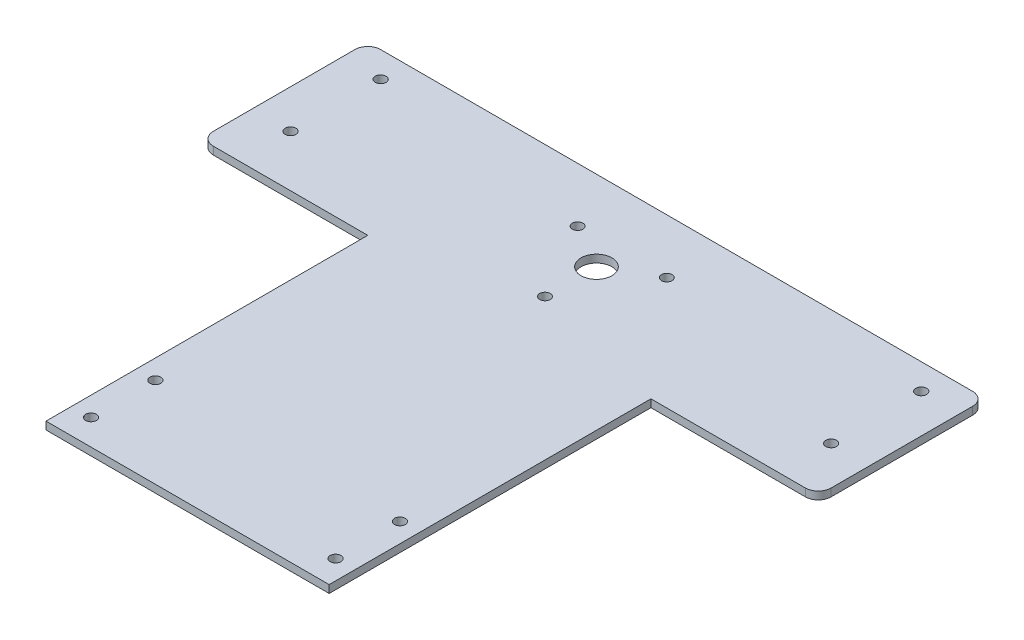
ISO-10303-21;
HEADER;
FILE_DESCRIPTION(('STEP AP214'),'2;1');
FILE_NAME('part.step','',(''),(''),'','','');
FILE_SCHEMA(('AUTOMOTIVE_DESIGN { 1 0 10303 214 1 1 1 1 }'));
ENDSEC;
DATA;
#1=APPLICATION_CONTEXT('core data for automotive mechanical design processes');
#2=APPLICATION_PROTOCOL_DEFINITION('international standard','automotive_design',2000,#1);
#3=PRODUCT_CONTEXT('',#1,'mechanical');
#4=PRODUCT('Part','Part','',(#3));
#5=PRODUCT_RELATED_PRODUCT_CATEGORY('part','',(#4));
#6=PRODUCT_DEFINITION_FORMATION('','',#4);
#7=PRODUCT_DEFINITION_CONTEXT('part definition',#1,'design');
#8=PRODUCT_DEFINITION('design','',#6,#7);
#9=PRODUCT_DEFINITION_SHAPE('','',#8);
#10=(LENGTH_UNIT() NAMED_UNIT(*) SI_UNIT(.MILLI.,.METRE.));
#11=(NAMED_UNIT(*) PLANE_ANGLE_UNIT() SI_UNIT($,.RADIAN.));
#12=(NAMED_UNIT(*) SI_UNIT($,.STERADIAN.) SOLID_ANGLE_UNIT());
#13=UNCERTAINTY_MEASURE_WITH_UNIT(LENGTH_MEASURE(1.E-05),#10,'distance_accuracy_value','');
#14=(GEOMETRIC_REPRESENTATION_CONTEXT(3) GLOBAL_UNCERTAINTY_ASSIGNED_CONTEXT((#13)) GLOBAL_UNIT_ASSIGNED_CONTEXT((#10,
#11,#12)) REPRESENTATION_CONTEXT('',''));
#15=CARTESIAN_POINT('',(0.,0.,0.));
#16=DIRECTION('',(0.,0.,1.));
#17=DIRECTION('',(1.,0.,0.));
#18=AXIS2_PLACEMENT_3D('',#15,#16,#17);
#19=CARTESIAN_POINT('',(0.,3.,0.));
#20=DIRECTION('',(0.,1.,0.));
#21=DIRECTION('',(0.,0.,1.));
#22=AXIS2_PLACEMENT_3D('',#19,#20,#21);
#23=PLANE('',#22);
#24=CARTESIAN_POINT('',(17.3205080756888,3.,-34.4697255648883));
#25=DIRECTION('',(0.,1.,0.));
#26=DIRECTION('',(0.,0.,1.));
#27=AXIS2_PLACEMENT_3D('',#24,#25,#26);
#28=CIRCLE('',#27,2.05);
#29=CARTESIAN_POINT('',(17.3205080756888,3.,-32.4197255648883));
#30=VERTEX_POINT('',#29);
#31=EDGE_CURVE('E616',#30,#30,#28,.T.);
#32=ORIENTED_EDGE('',*,*,#31,.F.);
#33=EDGE_LOOP('',(#32));
#34=FACE_BOUND('',#33,.T.);
#35=CARTESIAN_POINT('',(-17.3205080756887,3.,-34.4697255648885));
#36=DIRECTION('',(0.,1.,0.));
#37=DIRECTION('',(0.,0.,1.));
#38=AXIS2_PLACEMENT_3D('',#35,#36,#37);
#39=CIRCLE('',#38,2.05);
#40=CARTESIAN_POINT('',(-17.3205080756887,3.,-32.4197255648885));
#41=VERTEX_POINT('',#40);
#42=EDGE_CURVE('E612',#41,#41,#39,.T.);
#43=ORIENTED_EDGE('',*,*,#42,.F.);
#44=EDGE_LOOP('',(#43));
#45=FACE_BOUND('',#44,.T.);
#46=CARTESIAN_POINT('',(0.,3.,-4.46972556488845));
#47=DIRECTION('',(0.,1.,0.));
#48=DIRECTION('',(0.,0.,1.));
#49=AXIS2_PLACEMENT_3D('',#46,#47,#48);
#50=CIRCLE('',#49,2.05);
#51=CARTESIAN_POINT('',(0.,3.,-2.41972556488845));
#52=VERTEX_POINT('',#51);
#53=EDGE_CURVE('E416',#52,#52,#50,.T.);
#54=ORIENTED_EDGE('',*,*,#53,.F.);
#55=EDGE_LOOP('',(#54));
#56=FACE_BOUND('',#55,.T.);
#57=CARTESIAN_POINT('',(0.,3.,-24.4697255648884));
#58=DIRECTION('',(0.,1.,0.));
#59=DIRECTION('',(0.,0.,1.));
#60=AXIS2_PLACEMENT_3D('',#57,#58,#59);
#61=CIRCLE('',#60,6.);
#62=CARTESIAN_POINT('',(0.,3.,-18.4697255648884));
#63=VERTEX_POINT('',#62);
#64=EDGE_CURVE('E253',#63,#63,#61,.T.);
#65=ORIENTED_EDGE('',*,*,#64,.F.);
#66=EDGE_LOOP('',(#65));
#67=FACE_BOUND('',#66,.T.);
#68=CARTESIAN_POINT('',(-47.5,3.,99.3749999999999));
#69=DIRECTION('',(0.,-1.,0.));
#70=DIRECTION('',(0.,0.,-1.));
#71=AXIS2_PLACEMENT_3D('',#68,#69,#70);
#72=CIRCLE('',#71,2.1);
#73=CARTESIAN_POINT('',(-47.5,3.,97.2749999999999));
#74=VERTEX_POINT('',#73);
#75=EDGE_CURVE('E264',#74,#74,#72,.T.);
#76=ORIENTED_EDGE('',*,*,#75,.T.);
#77=EDGE_LOOP('',(#76));
#78=FACE_BOUND('',#77,.T.);
#79=CARTESIAN_POINT('',(-47.5,3.,124.375));
#80=DIRECTION('',(0.,1.,0.));
#81=DIRECTION('',(0.,0.,1.));
#82=AXIS2_PLACEMENT_3D('',#79,#80,#81);
#83=CIRCLE('',#82,2.1);
#84=CARTESIAN_POINT('',(-47.5,3.,126.475));
#85=VERTEX_POINT('',#84);
#86=EDGE_CURVE('E260',#85,#85,#83,.T.);
#87=ORIENTED_EDGE('',*,*,#86,.F.);
#88=EDGE_LOOP('',(#87));
#89=FACE_BOUND('',#88,.T.);
#90=CARTESIAN_POINT('',(47.5,3.,99.3749999999999));
#91=DIRECTION('',(0.,1.,0.));
#92=DIRECTION('',(0.,0.,1.));
#93=AXIS2_PLACEMENT_3D('',#90,#91,#92);
#94=CIRCLE('',#93,2.1);
#95=CARTESIAN_POINT('',(47.5,3.,101.475));
#96=VERTEX_POINT('',#95);
#97=EDGE_CURVE('E241',#96,#96,#94,.T.);
#98=ORIENTED_EDGE('',*,*,#97,.F.);
#99=EDGE_LOOP('',(#98));
#100=FACE_BOUND('',#99,.T.);
#101=CARTESIAN_POINT('',(105.,3.,-10.6250000000001));
#102=DIRECTION('',(0.,1.,0.));
#103=DIRECTION('',(0.,0.,1.));
#104=AXIS2_PLACEMENT_3D('',#101,#102,#103);
#105=CIRCLE('',#104,2.1);
#106=CARTESIAN_POINT('',(105.,3.,-8.52500000000007));
#107=VERTEX_POINT('',#106);
#108=EDGE_CURVE('E202',#107,#107,#105,.F.);
#109=ORIENTED_EDGE('',*,*,#108,.T.);
#110=EDGE_LOOP('',(#109));
#111=FACE_BOUND('',#110,.T.);
#112=CARTESIAN_POINT('',(-105.,3.,-10.6250000000001));
#113=DIRECTION('',(0.,1.,0.));
#114=DIRECTION('',(0.,0.,1.));
#115=AXIS2_PLACEMENT_3D('',#112,#113,#114);
#116=CIRCLE('',#115,2.1);
#117=CARTESIAN_POINT('',(-105.,3.,-8.52500000000006));
#118=VERTEX_POINT('',#117);
#119=EDGE_CURVE('E280',#118,#118,#116,.T.);
#120=ORIENTED_EDGE('',*,*,#119,.F.);
#121=EDGE_LOOP('',(#120));
#122=FACE_BOUND('',#121,.T.);
#123=CARTESIAN_POINT('',(-105.,3.,-45.6250000000001));
#124=DIRECTION('',(0.,1.,0.));
#125=DIRECTION('',(0.,0.,1.));
#126=AXIS2_PLACEMENT_3D('',#123,#124,#125);
#127=CIRCLE('',#126,2.1);
#128=CARTESIAN_POINT('',(-105.,3.,-43.5250000000001));
#129=VERTEX_POINT('',#128);
#130=EDGE_CURVE('E137',#129,#129,#127,.T.);
#131=ORIENTED_EDGE('',*,*,#130,.F.);
#132=EDGE_LOOP('',(#131));
#133=FACE_BOUND('',#132,.T.);
#134=DIRECTION('',(1.,0.,0.));
#135=VECTOR('',#134,1.);
#136=CARTESIAN_POINT('',(0.,3.,9.37499999999993));
#137=LINE('',#136,#135);
#138=CARTESIAN_POINT('',(55.,3.,9.37499999999993));
#139=VERTEX_POINT('',#138);
#140=CARTESIAN_POINT('',(115.,3.,9.37499999999993));
#141=VERTEX_POINT('',#140);
#142=EDGE_CURVE('E139',#139,#141,#137,.T.);
#143=ORIENTED_EDGE('',*,*,#142,.T.);
#144=CARTESIAN_POINT('',(115.,3.,4.37499999999993));
#145=DIRECTION('',(0.,1.,0.));
#146=DIRECTION('',(0.,0.,1.));
#147=AXIS2_PLACEMENT_3D('',#144,#145,#146);
#148=CIRCLE('',#147,5.);
#149=CARTESIAN_POINT('',(120.,3.,4.37499999999993));
#150=VERTEX_POINT('',#149);
#151=EDGE_CURVE('E227',#141,#150,#148,.T.);
#152=ORIENTED_EDGE('',*,*,#151,.T.);
#153=DIRECTION('',(0.,0.,-1.));
#154=VECTOR('',#153,1.);
#155=CARTESIAN_POINT('',(120.,3.,0.));
#156=LINE('',#155,#154);
#157=CARTESIAN_POINT('',(120.,3.,-50.6250000000001));
#158=VERTEX_POINT('',#157);
#159=EDGE_CURVE('E160',#150,#158,#156,.T.);
#160=ORIENTED_EDGE('',*,*,#159,.T.);
#161=CARTESIAN_POINT('',(115.,3.,-50.6250000000001));
#162=DIRECTION('',(0.,1.,0.));
#163=DIRECTION('',(0.,0.,1.));
#164=AXIS2_PLACEMENT_3D('',#161,#162,#163);
#165=CIRCLE('',#164,5.);
#166=CARTESIAN_POINT('',(115.,3.,-55.6250000000001));
#167=VERTEX_POINT('',#166);
#168=EDGE_CURVE('E223',#158,#167,#165,.T.);
#169=ORIENTED_EDGE('',*,*,#168,.T.);
#170=DIRECTION('',(1.,0.,0.));
#171=VECTOR('',#170,1.);
#172=CARTESIAN_POINT('',(0.,3.,-55.6250000000001));
#173=LINE('',#172,#171);
#174=CARTESIAN_POINT('',(-115.,3.,-55.6250000000001));
#175=VERTEX_POINT('',#174);
#176=EDGE_CURVE('E163',#175,#167,#173,.T.);
#177=ORIENTED_EDGE('',*,*,#176,.F.);
#178=CARTESIAN_POINT('',(-115.,3.,-50.6250000000001));
#179=DIRECTION('',(0.,1.,0.));
#180=DIRECTION('',(0.,0.,1.));
#181=AXIS2_PLACEMENT_3D('',#178,#179,#180);
#182=CIRCLE('',#181,5.);
#183=CARTESIAN_POINT('',(-120.,3.,-50.6250000000001));
#184=VERTEX_POINT('',#183);
#185=EDGE_CURVE('E52',#175,#184,#182,.T.);
#186=ORIENTED_EDGE('',*,*,#185,.T.);
#187=DIRECTION('',(0.,0.,-1.));
#188=VECTOR('',#187,1.);
#189=CARTESIAN_POINT('',(-120.,3.,0.));
#190=LINE('',#189,#188);
#191=CARTESIAN_POINT('',(-120.,3.,4.37499999999994));
#192=VERTEX_POINT('',#191);
#193=EDGE_CURVE('E166',#192,#184,#190,.T.);
#194=ORIENTED_EDGE('',*,*,#193,.F.);
#195=CARTESIAN_POINT('',(-115.,3.,4.37499999999994));
#196=DIRECTION('',(0.,1.,0.));
#197=DIRECTION('',(0.,0.,1.));
#198=AXIS2_PLACEMENT_3D('',#195,#196,#197);
#199=CIRCLE('',#198,5.);
#200=CARTESIAN_POINT('',(-115.,3.,9.37499999999994));
#201=VERTEX_POINT('',#200);
#202=EDGE_CURVE('E133',#192,#201,#199,.T.);
#203=ORIENTED_EDGE('',*,*,#202,.T.);
#204=CARTESIAN_POINT('',(-55.,3.,9.37499999999994));
#205=VERTEX_POINT('',#204);
#206=EDGE_CURVE('E126',#201,#205,#137,.T.);
#207=ORIENTED_EDGE('',*,*,#206,.T.);
#208=DIRECTION('',(0.,0.,-1.));
#209=VECTOR('',#208,1.);
#210=CARTESIAN_POINT('',(-55.,3.,0.));
#211=LINE('',#210,#209);
#212=CARTESIAN_POINT('',(-55.,3.,134.375));
#213=VERTEX_POINT('',#212);
#214=EDGE_CURVE('E131',#213,#205,#211,.T.);
#215=ORIENTED_EDGE('',*,*,#214,.F.);
#216=DIRECTION('',(1.,0.,0.));
#217=VECTOR('',#216,1.);
#218=CARTESIAN_POINT('',(0.,3.,134.375));
#219=LINE('',#218,#217);
#220=CARTESIAN_POINT('',(55.,3.,134.375));
#221=VERTEX_POINT('',#220);
#222=EDGE_CURVE('E153',#213,#221,#219,.T.);
#223=ORIENTED_EDGE('',*,*,#222,.T.);
#224=DIRECTION('',(0.,0.,-1.));
#225=VECTOR('',#224,1.);
#226=CARTESIAN_POINT('',(55.,3.,0.));
#227=LINE('',#226,#225);
#228=EDGE_CURVE('E155',#221,#139,#227,.T.);
#229=ORIENTED_EDGE('',*,*,#228,.T.);
#230=EDGE_LOOP('',(#143,#152,#160,#169,#177,#186,#194,#203,#207,#215,#223,#229));
#231=FACE_BOUND('',#230,.T.);
#232=CARTESIAN_POINT('',(105.,3.,-45.6250000000001));
#233=DIRECTION('',(0.,1.,0.));
#234=DIRECTION('',(0.,0.,1.));
#235=AXIS2_PLACEMENT_3D('',#232,#233,#234);
#236=CIRCLE('',#235,2.1);
#237=CARTESIAN_POINT('',(105.,3.,-43.5250000000001));
#238=VERTEX_POINT('',#237);
#239=EDGE_CURVE('E168',#238,#238,#236,.F.);
#240=ORIENTED_EDGE('',*,*,#239,.T.);
#241=EDGE_LOOP('',(#240));
#242=FACE_BOUND('',#241,.T.);
#243=CARTESIAN_POINT('',(47.5,3.,124.375));
#244=DIRECTION('',(0.,-1.,0.));
#245=DIRECTION('',(0.,0.,-1.));
#246=AXIS2_PLACEMENT_3D('',#243,#244,#245);
#247=CIRCLE('',#246,2.1);
#248=CARTESIAN_POINT('',(47.5,3.,122.275));
#249=VERTEX_POINT('',#248);
#250=EDGE_CURVE('E269',#249,#249,#247,.T.);
#251=ORIENTED_EDGE('',*,*,#250,.T.);
#252=EDGE_LOOP('',(#251));
#253=FACE_BOUND('',#252,.T.);
#254=ADVANCED_FACE('F35',(#34,#45,#56,#67,#78,#89,#100,#111,#122,#133,#231,#242,#253),#23,.T.);
#255=CARTESIAN_POINT('',(0.,0.,0.));
#256=DIRECTION('',(0.,1.,0.));
#257=DIRECTION('',(0.,0.,1.));
#258=AXIS2_PLACEMENT_3D('',#255,#256,#257);
#259=PLANE('',#258);
#260=CARTESIAN_POINT('',(17.3205080756888,0.,-34.4697255648883));
#261=DIRECTION('',(0.,1.,0.));
#262=DIRECTION('',(0.,0.,1.));
#263=AXIS2_PLACEMENT_3D('',#260,#261,#262);
#264=CIRCLE('',#263,2.05);
#265=CARTESIAN_POINT('',(17.3205080756888,0.,-32.4197255648883));
#266=VERTEX_POINT('',#265);
#267=EDGE_CURVE('E39',#266,#266,#264,.T.);
#268=ORIENTED_EDGE('',*,*,#267,.T.);
#269=EDGE_LOOP('',(#268));
#270=FACE_BOUND('',#269,.T.);
#271=CARTESIAN_POINT('',(-17.3205080756887,0.,-34.4697255648885));
#272=DIRECTION('',(0.,1.,0.));
#273=DIRECTION('',(0.,0.,1.));
#274=AXIS2_PLACEMENT_3D('',#271,#272,#273);
#275=CIRCLE('',#274,2.05);
#276=CARTESIAN_POINT('',(-17.3205080756887,0.,-32.4197255648885));
#277=VERTEX_POINT('',#276);
#278=EDGE_CURVE('E255',#277,#277,#275,.T.);
#279=ORIENTED_EDGE('',*,*,#278,.T.);
#280=EDGE_LOOP('',(#279));
#281=FACE_BOUND('',#280,.T.);
#282=CARTESIAN_POINT('',(0.,0.,-4.46972556488845));
#283=DIRECTION('',(0.,1.,0.));
#284=DIRECTION('',(0.,0.,1.));
#285=AXIS2_PLACEMENT_3D('',#282,#283,#284);
#286=CIRCLE('',#285,2.05);
#287=CARTESIAN_POINT('',(0.,0.,-2.41972556488845));
#288=VERTEX_POINT('',#287);
#289=EDGE_CURVE('E252',#288,#288,#286,.T.);
#290=ORIENTED_EDGE('',*,*,#289,.T.);
#291=EDGE_LOOP('',(#290));
#292=FACE_BOUND('',#291,.T.);
#293=CARTESIAN_POINT('',(0.,0.,-24.4697255648884));
#294=DIRECTION('',(0.,1.,0.));
#295=DIRECTION('',(0.,0.,1.));
#296=AXIS2_PLACEMENT_3D('',#293,#294,#295);
#297=CIRCLE('',#296,6.);
#298=CARTESIAN_POINT('',(0.,0.,-18.4697255648884));
#299=VERTEX_POINT('',#298);
#300=EDGE_CURVE('E249',#299,#299,#297,.T.);
#301=ORIENTED_EDGE('',*,*,#300,.T.);
#302=EDGE_LOOP('',(#301));
#303=FACE_BOUND('',#302,.T.);
#304=CARTESIAN_POINT('',(-47.5,0.,124.375));
#305=DIRECTION('',(0.,1.,0.));
#306=DIRECTION('',(0.,0.,1.));
#307=AXIS2_PLACEMENT_3D('',#304,#305,#306);
#308=CIRCLE('',#307,2.1);
#309=CARTESIAN_POINT('',(-47.5,0.,126.475));
#310=VERTEX_POINT('',#309);
#311=EDGE_CURVE('E240',#310,#310,#308,.T.);
#312=ORIENTED_EDGE('',*,*,#311,.T.);
#313=EDGE_LOOP('',(#312));
#314=FACE_BOUND('',#313,.T.);
#315=CARTESIAN_POINT('',(47.5,0.,99.3749999999999));
#316=DIRECTION('',(0.,1.,0.));
#317=DIRECTION('',(0.,0.,1.));
#318=AXIS2_PLACEMENT_3D('',#315,#316,#317);
#319=CIRCLE('',#318,2.1);
#320=CARTESIAN_POINT('',(47.5,0.,101.475));
#321=VERTEX_POINT('',#320);
#322=EDGE_CURVE('E237',#321,#321,#319,.T.);
#323=ORIENTED_EDGE('',*,*,#322,.T.);
#324=EDGE_LOOP('',(#323));
#325=FACE_BOUND('',#324,.T.);
#326=CARTESIAN_POINT('',(105.,0.,-10.6250000000001));
#327=DIRECTION('',(0.,1.,0.));
#328=DIRECTION('',(0.,0.,1.));
#329=AXIS2_PLACEMENT_3D('',#326,#327,#328);
#330=CIRCLE('',#329,2.1);
#331=CARTESIAN_POINT('',(105.,0.,-8.52500000000007));
#332=VERTEX_POINT('',#331);
#333=EDGE_CURVE('E172',#332,#332,#330,.F.);
#334=ORIENTED_EDGE('',*,*,#333,.F.);
#335=EDGE_LOOP('',(#334));
#336=FACE_BOUND('',#335,.T.);
#337=CARTESIAN_POINT('',(-105.,0.,-10.6250000000001));
#338=DIRECTION('',(0.,1.,0.));
#339=DIRECTION('',(0.,0.,1.));
#340=AXIS2_PLACEMENT_3D('',#337,#338,#339);
#341=CIRCLE('',#340,2.1);
#342=CARTESIAN_POINT('',(-105.,0.,-8.52500000000006));
#343=VERTEX_POINT('',#342);
#344=EDGE_CURVE('E175',#343,#343,#341,.T.);
#345=ORIENTED_EDGE('',*,*,#344,.T.);
#346=EDGE_LOOP('',(#345));
#347=FACE_BOUND('',#346,.T.);
#348=CARTESIAN_POINT('',(-105.,0.,-45.6250000000001));
#349=DIRECTION('',(0.,1.,0.));
#350=DIRECTION('',(0.,0.,1.));
#351=AXIS2_PLACEMENT_3D('',#348,#349,#350);
#352=CIRCLE('',#351,2.1);
#353=CARTESIAN_POINT('',(-105.,0.,-43.5250000000001));
#354=VERTEX_POINT('',#353);
#355=EDGE_CURVE('E179',#354,#354,#352,.T.);
#356=ORIENTED_EDGE('',*,*,#355,.T.);
#357=EDGE_LOOP('',(#356));
#358=FACE_BOUND('',#357,.T.);
#359=DIRECTION('',(0.,0.,-1.));
#360=VECTOR('',#359,1.);
#361=CARTESIAN_POINT('',(120.,0.,0.));
#362=LINE('',#361,#360);
#363=CARTESIAN_POINT('',(120.,0.,4.37499999999993));
#364=VERTEX_POINT('',#363);
#365=CARTESIAN_POINT('',(120.,0.,-50.6250000000001));
#366=VERTEX_POINT('',#365);
#367=EDGE_CURVE('E190',#364,#366,#362,.T.);
#368=ORIENTED_EDGE('',*,*,#367,.F.);
#369=CARTESIAN_POINT('',(115.,0.,4.37499999999993));
#370=DIRECTION('',(0.,1.,0.));
#371=DIRECTION('',(0.,0.,1.));
#372=AXIS2_PLACEMENT_3D('',#369,#370,#371);
#373=CIRCLE('',#372,5.);
#374=CARTESIAN_POINT('',(115.,0.,9.37499999999993));
#375=VERTEX_POINT('',#374);
#376=EDGE_CURVE('E219',#364,#375,#373,.F.);
#377=ORIENTED_EDGE('',*,*,#376,.T.);
#378=DIRECTION('',(1.,0.,0.));
#379=VECTOR('',#378,1.);
#380=CARTESIAN_POINT('',(0.,0.,9.37499999999993));
#381=LINE('',#380,#379);
#382=CARTESIAN_POINT('',(55.,0.,9.37499999999993));
#383=VERTEX_POINT('',#382);
#384=EDGE_CURVE('E184',#383,#375,#381,.T.);
#385=ORIENTED_EDGE('',*,*,#384,.F.);
#386=DIRECTION('',(0.,0.,-1.));
#387=VECTOR('',#386,1.);
#388=CARTESIAN_POINT('',(55.,0.,0.));
#389=LINE('',#388,#387);
#390=CARTESIAN_POINT('',(55.,0.,134.375));
#391=VERTEX_POINT('',#390);
#392=EDGE_CURVE('E188',#391,#383,#389,.T.);
#393=ORIENTED_EDGE('',*,*,#392,.F.);
#394=DIRECTION('',(1.,0.,0.));
#395=VECTOR('',#394,1.);
#396=CARTESIAN_POINT('',(0.,0.,134.375));
#397=LINE('',#396,#395);
#398=CARTESIAN_POINT('',(-55.,0.,134.375));
#399=VERTEX_POINT('',#398);
#400=EDGE_CURVE('E186',#399,#391,#397,.T.);
#401=ORIENTED_EDGE('',*,*,#400,.F.);
#402=DIRECTION('',(0.,0.,-1.));
#403=VECTOR('',#402,1.);
#404=CARTESIAN_POINT('',(-55.,0.,0.));
#405=LINE('',#404,#403);
#406=CARTESIAN_POINT('',(-55.,0.,9.37499999999994));
#407=VERTEX_POINT('',#406);
#408=EDGE_CURVE('E183',#399,#407,#405,.T.);
#409=ORIENTED_EDGE('',*,*,#408,.T.);
#410=CARTESIAN_POINT('',(-115.,0.,9.37499999999994));
#411=VERTEX_POINT('',#410);
#412=EDGE_CURVE('E144',#411,#407,#381,.T.);
#413=ORIENTED_EDGE('',*,*,#412,.F.);
#414=CARTESIAN_POINT('',(-115.,0.,4.37499999999994));
#415=DIRECTION('',(0.,1.,0.));
#416=DIRECTION('',(0.,0.,1.));
#417=AXIS2_PLACEMENT_3D('',#414,#415,#416);
#418=CIRCLE('',#417,5.);
#419=CARTESIAN_POINT('',(-120.,0.,4.37499999999994));
#420=VERTEX_POINT('',#419);
#421=EDGE_CURVE('E217',#411,#420,#418,.F.);
#422=ORIENTED_EDGE('',*,*,#421,.T.);
#423=DIRECTION('',(0.,0.,-1.));
#424=VECTOR('',#423,1.);
#425=CARTESIAN_POINT('',(-120.,0.,0.));
#426=LINE('',#425,#424);
#427=CARTESIAN_POINT('',(-120.,0.,-50.6250000000001));
#428=VERTEX_POINT('',#427);
#429=EDGE_CURVE('E196',#420,#428,#426,.T.);
#430=ORIENTED_EDGE('',*,*,#429,.T.);
#431=CARTESIAN_POINT('',(-115.,0.,-50.6250000000001));
#432=DIRECTION('',(0.,1.,0.));
#433=DIRECTION('',(0.,0.,1.));
#434=AXIS2_PLACEMENT_3D('',#431,#432,#433);
#435=CIRCLE('',#434,5.);
#436=CARTESIAN_POINT('',(-115.,0.,-55.6250000000001));
#437=VERTEX_POINT('',#436);
#438=EDGE_CURVE('E215',#428,#437,#435,.F.);
#439=ORIENTED_EDGE('',*,*,#438,.T.);
#440=DIRECTION('',(1.,0.,0.));
#441=VECTOR('',#440,1.);
#442=CARTESIAN_POINT('',(0.,0.,-55.6250000000001));
#443=LINE('',#442,#441);
#444=CARTESIAN_POINT('',(115.,0.,-55.6250000000001));
#445=VERTEX_POINT('',#444);
#446=EDGE_CURVE('E193',#437,#445,#443,.T.);
#447=ORIENTED_EDGE('',*,*,#446,.T.);
#448=CARTESIAN_POINT('',(115.,0.,-50.6250000000001));
#449=DIRECTION('',(0.,1.,0.));
#450=DIRECTION('',(0.,0.,1.));
#451=AXIS2_PLACEMENT_3D('',#448,#449,#450);
#452=CIRCLE('',#451,5.);
#453=EDGE_CURVE('E213',#445,#366,#452,.F.);
#454=ORIENTED_EDGE('',*,*,#453,.T.);
#455=EDGE_LOOP('',(#368,#377,#385,#393,#401,#409,#413,#422,#430,#439,#447,#454));
#456=FACE_BOUND('',#455,.T.);
#457=CARTESIAN_POINT('',(105.,0.,-45.6250000000001));
#458=DIRECTION('',(0.,1.,0.));
#459=DIRECTION('',(0.,0.,1.));
#460=AXIS2_PLACEMENT_3D('',#457,#458,#459);
#461=CIRCLE('',#460,2.1);
#462=CARTESIAN_POINT('',(105.,0.,-43.5250000000001));
#463=VERTEX_POINT('',#462);
#464=EDGE_CURVE('E199',#463,#463,#461,.F.);
#465=ORIENTED_EDGE('',*,*,#464,.F.);
#466=EDGE_LOOP('',(#465));
#467=FACE_BOUND('',#466,.T.);
#468=CARTESIAN_POINT('',(-47.5,0.,99.3749999999999));
#469=DIRECTION('',(0.,1.,0.));
#470=DIRECTION('',(0.,0.,1.));
#471=AXIS2_PLACEMENT_3D('',#468,#469,#470);
#472=CIRCLE('',#471,2.1);
#473=CARTESIAN_POINT('',(-47.5,0.,101.475));
#474=VERTEX_POINT('',#473);
#475=EDGE_CURVE('E244',#474,#474,#472,.F.);
#476=ORIENTED_EDGE('',*,*,#475,.F.);
#477=EDGE_LOOP('',(#476));
#478=FACE_BOUND('',#477,.T.);
#479=CARTESIAN_POINT('',(47.5,0.,124.375));
#480=DIRECTION('',(0.,1.,0.));
#481=DIRECTION('',(0.,0.,1.));
#482=AXIS2_PLACEMENT_3D('',#479,#480,#481);
#483=CIRCLE('',#482,2.1);
#484=CARTESIAN_POINT('',(47.5,0.,126.475));
#485=VERTEX_POINT('',#484);
#486=EDGE_CURVE('E176',#485,#485,#483,.F.);
#487=ORIENTED_EDGE('',*,*,#486,.F.);
#488=EDGE_LOOP('',(#487));
#489=FACE_BOUND('',#488,.T.);
#490=ADVANCED_FACE('F289',(#270,#281,#292,#303,#314,#325,#336,#347,#358,#456,#467,#478,#489),
#259,.F.);
#491=CARTESIAN_POINT('',(0.,3.,9.37499999999993));
#492=DIRECTION('',(0.,0.,-1.));
#493=DIRECTION('',(-1.,0.,0.));
#494=AXIS2_PLACEMENT_3D('',#491,#492,#493);
#495=PLANE('',#494);
#496=ORIENTED_EDGE('',*,*,#206,.F.);
#497=DIRECTION('',(0.,-1.,0.));
#498=VECTOR('',#497,1.);
#499=CARTESIAN_POINT('',(-115.,0.,9.37499999999994));
#500=LINE('',#499,#498);
#501=EDGE_CURVE('E229',#201,#411,#500,.T.);
#502=ORIENTED_EDGE('',*,*,#501,.T.);
#503=ORIENTED_EDGE('',*,*,#412,.T.);
#504=DIRECTION('',(0.,-1.,0.));
#505=VECTOR('',#504,1.);
#506=CARTESIAN_POINT('',(-55.,3.,9.37499999999994));
#507=LINE('',#506,#505);
#508=EDGE_CURVE('E141',#205,#407,#507,.T.);
#509=ORIENTED_EDGE('',*,*,#508,.F.);
#510=EDGE_LOOP('',(#496,#502,#503,#509));
#511=FACE_BOUND('',#510,.T.);
#512=ADVANCED_FACE('F142',(#511),#495,.F.);
#513=CARTESIAN_POINT('',(-55.,3.,0.));
#514=DIRECTION('',(-1.,0.,0.));
#515=DIRECTION('',(0.,0.,1.));
#516=AXIS2_PLACEMENT_3D('',#513,#514,#515);
#517=PLANE('',#516);
#518=ORIENTED_EDGE('',*,*,#408,.F.);
#519=DIRECTION('',(0.,-1.,0.));
#520=VECTOR('',#519,1.);
#521=CARTESIAN_POINT('',(-55.,3.,134.375));
#522=LINE('',#521,#520);
#523=EDGE_CURVE('E149',#213,#399,#522,.T.);
#524=ORIENTED_EDGE('',*,*,#523,.F.);
#525=ORIENTED_EDGE('',*,*,#214,.T.);
#526=ORIENTED_EDGE('',*,*,#508,.T.);
#527=EDGE_LOOP('',(#518,#524,#525,#526));
#528=FACE_BOUND('',#527,.T.);
#529=ADVANCED_FACE('F151',(#528),#517,.T.);
#530=CARTESIAN_POINT('',(0.,3.,134.375));
#531=DIRECTION('',(0.,0.,-1.));
#532=DIRECTION('',(-1.,0.,0.));
#533=AXIS2_PLACEMENT_3D('',#530,#531,#532);
#534=PLANE('',#533);
#535=ORIENTED_EDGE('',*,*,#400,.T.);
#536=DIRECTION('',(0.,-1.,0.));
#537=VECTOR('',#536,1.);
#538=CARTESIAN_POINT('',(55.,3.,134.375));
#539=LINE('',#538,#537);
#540=EDGE_CURVE('E205',#221,#391,#539,.T.);
#541=ORIENTED_EDGE('',*,*,#540,.F.);
#542=ORIENTED_EDGE('',*,*,#222,.F.);
#543=ORIENTED_EDGE('',*,*,#523,.T.);
#544=EDGE_LOOP('',(#535,#541,#542,#543));
#545=FACE_BOUND('',#544,.T.);
#546=ADVANCED_FACE('F326',(#545),#534,.F.);
#547=CARTESIAN_POINT('',(55.,3.,0.));
#548=DIRECTION('',(-1.,0.,0.));
#549=DIRECTION('',(0.,0.,1.));
#550=AXIS2_PLACEMENT_3D('',#547,#548,#549);
#551=PLANE('',#550);
#552=ORIENTED_EDGE('',*,*,#392,.T.);
#553=DIRECTION('',(0.,-1.,0.));
#554=VECTOR('',#553,1.);
#555=CARTESIAN_POINT('',(55.,3.,9.37499999999993));
#556=LINE('',#555,#554);
#557=EDGE_CURVE('E171',#139,#383,#556,.T.);
#558=ORIENTED_EDGE('',*,*,#557,.F.);
#559=ORIENTED_EDGE('',*,*,#228,.F.);
#560=ORIENTED_EDGE('',*,*,#540,.T.);
#561=EDGE_LOOP('',(#552,#558,#559,#560));
#562=FACE_BOUND('',#561,.T.);
#563=ADVANCED_FACE('F322',(#562),#551,.F.);
#564=ORIENTED_EDGE('',*,*,#384,.T.);
#565=DIRECTION('',(0.,-1.,0.));
#566=VECTOR('',#565,1.);
#567=CARTESIAN_POINT('',(115.,3.,9.37499999999993));
#568=LINE('',#567,#566);
#569=EDGE_CURVE('E221',#375,#141,#568,.F.);
#570=ORIENTED_EDGE('',*,*,#569,.T.);
#571=ORIENTED_EDGE('',*,*,#142,.F.);
#572=ORIENTED_EDGE('',*,*,#557,.T.);
#573=EDGE_LOOP('',(#564,#570,#571,#572));
#574=FACE_BOUND('',#573,.T.);
#575=ADVANCED_FACE('F318',(#574),#495,.F.);
#576=CARTESIAN_POINT('',(120.,3.,0.));
#577=DIRECTION('',(-1.,0.,0.));
#578=DIRECTION('',(0.,0.,1.));
#579=AXIS2_PLACEMENT_3D('',#576,#577,#578);
#580=PLANE('',#579);
#581=ORIENTED_EDGE('',*,*,#159,.F.);
#582=DIRECTION('',(0.,-1.,0.));
#583=VECTOR('',#582,1.);
#584=CARTESIAN_POINT('',(120.,3.,4.37499999999993));
#585=LINE('',#584,#583);
#586=EDGE_CURVE('E210',#150,#364,#585,.T.);
#587=ORIENTED_EDGE('',*,*,#586,.T.);
#588=ORIENTED_EDGE('',*,*,#367,.T.);
#589=DIRECTION('',(0.,-1.,0.));
#590=VECTOR('',#589,1.);
#591=CARTESIAN_POINT('',(120.,3.,-50.6250000000001));
#592=LINE('',#591,#590);
#593=EDGE_CURVE('E148',#366,#158,#592,.F.);
#594=ORIENTED_EDGE('',*,*,#593,.T.);
#595=EDGE_LOOP('',(#581,#587,#588,#594));
#596=FACE_BOUND('',#595,.T.);
#597=ADVANCED_FACE('F314',(#596),#580,.F.);
#598=CARTESIAN_POINT('',(0.,3.,-55.6250000000001));
#599=DIRECTION('',(0.,0.,-1.));
#600=DIRECTION('',(-1.,0.,0.));
#601=AXIS2_PLACEMENT_3D('',#598,#599,#600);
#602=PLANE('',#601);
#603=ORIENTED_EDGE('',*,*,#446,.F.);
#604=DIRECTION('',(0.,-1.,0.));
#605=VECTOR('',#604,1.);
#606=CARTESIAN_POINT('',(-115.,3.,-55.6250000000001));
#607=LINE('',#606,#605);
#608=EDGE_CURVE('E11',#437,#175,#607,.F.);
#609=ORIENTED_EDGE('',*,*,#608,.T.);
#610=ORIENTED_EDGE('',*,*,#176,.T.);
#611=DIRECTION('',(0.,-1.,0.));
#612=VECTOR('',#611,1.);
#613=CARTESIAN_POINT('',(115.,0.,-55.6250000000001));
#614=LINE('',#613,#612);
#615=EDGE_CURVE('E44',#167,#445,#614,.T.);
#616=ORIENTED_EDGE('',*,*,#615,.T.);
#617=EDGE_LOOP('',(#603,#609,#610,#616));
#618=FACE_BOUND('',#617,.T.);
#619=ADVANCED_FACE('F311',(#618),#602,.T.);
#620=CARTESIAN_POINT('',(-120.,3.,0.));
#621=DIRECTION('',(-1.,0.,0.));
#622=DIRECTION('',(0.,0.,1.));
#623=AXIS2_PLACEMENT_3D('',#620,#621,#622);
#624=PLANE('',#623);
#625=ORIENTED_EDGE('',*,*,#429,.F.);
#626=DIRECTION('',(0.,-1.,0.));
#627=VECTOR('',#626,1.);
#628=CARTESIAN_POINT('',(-120.,3.,4.37499999999994));
#629=LINE('',#628,#627);
#630=EDGE_CURVE('E59',#420,#192,#629,.F.);
#631=ORIENTED_EDGE('',*,*,#630,.T.);
#632=ORIENTED_EDGE('',*,*,#193,.T.);
#633=DIRECTION('',(0.,-1.,0.));
#634=VECTOR('',#633,1.);
#635=CARTESIAN_POINT('',(-120.,3.,-50.6250000000001));
#636=LINE('',#635,#634);
#637=EDGE_CURVE('E231',#184,#428,#636,.T.);
#638=ORIENTED_EDGE('',*,*,#637,.T.);
#639=EDGE_LOOP('',(#625,#631,#632,#638));
#640=FACE_BOUND('',#639,.T.);
#641=ADVANCED_FACE('F308',(#640),#624,.T.);
#642=CARTESIAN_POINT('',(-105.,3.,-45.6250000000001));
#643=DIRECTION('',(0.,-1.,0.));
#644=DIRECTION('',(0.,0.,-1.));
#645=AXIS2_PLACEMENT_3D('',#642,#643,#644);
#646=CYLINDRICAL_SURFACE('',#645,2.1);
#647=ORIENTED_EDGE('',*,*,#130,.T.);
#648=EDGE_LOOP('',(#647));
#649=FACE_BOUND('',#648,.T.);
#650=ORIENTED_EDGE('',*,*,#355,.F.);
#651=EDGE_LOOP('',(#650));
#652=FACE_BOUND('',#651,.T.);
#653=ADVANCED_FACE('F285',(#649,#652),#646,.F.);
#654=CARTESIAN_POINT('',(-105.,3.,-10.6250000000001));
#655=DIRECTION('',(0.,-1.,0.));
#656=DIRECTION('',(0.,0.,-1.));
#657=AXIS2_PLACEMENT_3D('',#654,#655,#656);
#658=CYLINDRICAL_SURFACE('',#657,2.1);
#659=ORIENTED_EDGE('',*,*,#119,.T.);
#660=EDGE_LOOP('',(#659));
#661=FACE_BOUND('',#660,.T.);
#662=ORIENTED_EDGE('',*,*,#344,.F.);
#663=EDGE_LOOP('',(#662));
#664=FACE_BOUND('',#663,.T.);
#665=ADVANCED_FACE('F335',(#661,#664),#658,.F.);
#666=CARTESIAN_POINT('',(105.,3.,-10.6250000000001));
#667=DIRECTION('',(0.,-1.,0.));
#668=DIRECTION('',(0.,0.,-1.));
#669=AXIS2_PLACEMENT_3D('',#666,#667,#668);
#670=CYLINDRICAL_SURFACE('',#669,2.1);
#671=ORIENTED_EDGE('',*,*,#108,.F.);
#672=EDGE_LOOP('',(#671));
#673=FACE_BOUND('',#672,.T.);
#674=ORIENTED_EDGE('',*,*,#333,.T.);
#675=EDGE_LOOP('',(#674));
#676=FACE_BOUND('',#675,.T.);
#677=ADVANCED_FACE('F306',(#673,#676),#670,.F.);
#678=CARTESIAN_POINT('',(105.,3.,-45.6250000000001));
#679=DIRECTION('',(0.,-1.,0.));
#680=DIRECTION('',(0.,0.,-1.));
#681=AXIS2_PLACEMENT_3D('',#678,#679,#680);
#682=CYLINDRICAL_SURFACE('',#681,2.1);
#683=ORIENTED_EDGE('',*,*,#239,.F.);
#684=EDGE_LOOP('',(#683));
#685=FACE_BOUND('',#684,.T.);
#686=ORIENTED_EDGE('',*,*,#464,.T.);
#687=EDGE_LOOP('',(#686));
#688=FACE_BOUND('',#687,.T.);
#689=ADVANCED_FACE('F302',(#685,#688),#682,.F.);
#690=CARTESIAN_POINT('',(115.,3.,4.37499999999993));
#691=DIRECTION('',(0.,-1.,0.));
#692=DIRECTION('',(0.,0.,-1.));
#693=AXIS2_PLACEMENT_3D('',#690,#691,#692);
#694=CYLINDRICAL_SURFACE('',#693,5.);
#695=ORIENTED_EDGE('',*,*,#151,.F.);
#696=ORIENTED_EDGE('',*,*,#569,.F.);
#697=ORIENTED_EDGE('',*,*,#376,.F.);
#698=ORIENTED_EDGE('',*,*,#586,.F.);
#699=EDGE_LOOP('',(#695,#696,#697,#698));
#700=FACE_BOUND('',#699,.T.);
#701=ADVANCED_FACE('F305',(#700),#694,.T.);
#702=CARTESIAN_POINT('',(-115.,3.,4.37499999999994));
#703=DIRECTION('',(0.,1.,0.));
#704=DIRECTION('',(0.,0.,1.));
#705=AXIS2_PLACEMENT_3D('',#702,#703,#704);
#706=CYLINDRICAL_SURFACE('',#705,5.);
#707=ORIENTED_EDGE('',*,*,#202,.F.);
#708=ORIENTED_EDGE('',*,*,#630,.F.);
#709=ORIENTED_EDGE('',*,*,#421,.F.);
#710=ORIENTED_EDGE('',*,*,#501,.F.);
#711=EDGE_LOOP('',(#707,#708,#709,#710));
#712=FACE_BOUND('',#711,.T.);
#713=ADVANCED_FACE('F344',(#712),#706,.T.);
#714=CARTESIAN_POINT('',(-115.,3.,-50.6250000000001));
#715=DIRECTION('',(0.,-1.,0.));
#716=DIRECTION('',(0.,0.,-1.));
#717=AXIS2_PLACEMENT_3D('',#714,#715,#716);
#718=CYLINDRICAL_SURFACE('',#717,5.);
#719=ORIENTED_EDGE('',*,*,#185,.F.);
#720=ORIENTED_EDGE('',*,*,#608,.F.);
#721=ORIENTED_EDGE('',*,*,#438,.F.);
#722=ORIENTED_EDGE('',*,*,#637,.F.);
#723=EDGE_LOOP('',(#719,#720,#721,#722));
#724=FACE_BOUND('',#723,.T.);
#725=ADVANCED_FACE('F347',(#724),#718,.T.);
#726=CARTESIAN_POINT('',(115.,3.,-50.6250000000001));
#727=DIRECTION('',(0.,1.,0.));
#728=DIRECTION('',(0.,0.,1.));
#729=AXIS2_PLACEMENT_3D('',#726,#727,#728);
#730=CYLINDRICAL_SURFACE('',#729,5.);
#731=ORIENTED_EDGE('',*,*,#168,.F.);
#732=ORIENTED_EDGE('',*,*,#593,.F.);
#733=ORIENTED_EDGE('',*,*,#453,.F.);
#734=ORIENTED_EDGE('',*,*,#615,.F.);
#735=EDGE_LOOP('',(#731,#732,#733,#734));
#736=FACE_BOUND('',#735,.T.);
#737=ADVANCED_FACE('F37',(#736),#730,.T.);
#738=CARTESIAN_POINT('',(47.5,-7.,99.3749999999999));
#739=DIRECTION('',(0.,1.,0.));
#740=DIRECTION('',(0.,0.,1.));
#741=AXIS2_PLACEMENT_3D('',#738,#739,#740);
#742=CYLINDRICAL_SURFACE('',#741,2.1);
#743=ORIENTED_EDGE('',*,*,#97,.T.);
#744=EDGE_LOOP('',(#743));
#745=FACE_BOUND('',#744,.T.);
#746=ORIENTED_EDGE('',*,*,#322,.F.);
#747=EDGE_LOOP('',(#746));
#748=FACE_BOUND('',#747,.T.);
#749=ADVANCED_FACE('F299',(#745,#748),#742,.F.);
#750=CARTESIAN_POINT('',(-47.5,-7.,124.375));
#751=DIRECTION('',(0.,1.,0.));
#752=DIRECTION('',(0.,0.,1.));
#753=AXIS2_PLACEMENT_3D('',#750,#751,#752);
#754=CYLINDRICAL_SURFACE('',#753,2.1);
#755=ORIENTED_EDGE('',*,*,#86,.T.);
#756=EDGE_LOOP('',(#755));
#757=FACE_BOUND('',#756,.T.);
#758=ORIENTED_EDGE('',*,*,#311,.F.);
#759=EDGE_LOOP('',(#758));
#760=FACE_BOUND('',#759,.T.);
#761=ADVANCED_FACE('F395',(#757,#760),#754,.F.);
#762=CARTESIAN_POINT('',(-47.5,-7.,99.3749999999999));
#763=DIRECTION('',(0.,1.,0.));
#764=DIRECTION('',(0.,0.,1.));
#765=AXIS2_PLACEMENT_3D('',#762,#763,#764);
#766=CYLINDRICAL_SURFACE('',#765,2.1);
#767=ORIENTED_EDGE('',*,*,#75,.F.);
#768=EDGE_LOOP('',(#767));
#769=FACE_BOUND('',#768,.T.);
#770=ORIENTED_EDGE('',*,*,#475,.T.);
#771=EDGE_LOOP('',(#770));
#772=FACE_BOUND('',#771,.T.);
#773=ADVANCED_FACE('F385',(#769,#772),#766,.F.);
#774=CARTESIAN_POINT('',(47.5,-7.,124.375));
#775=DIRECTION('',(0.,1.,0.));
#776=DIRECTION('',(0.,0.,1.));
#777=AXIS2_PLACEMENT_3D('',#774,#775,#776);
#778=CYLINDRICAL_SURFACE('',#777,2.1);
#779=ORIENTED_EDGE('',*,*,#250,.F.);
#780=EDGE_LOOP('',(#779));
#781=FACE_BOUND('',#780,.T.);
#782=ORIENTED_EDGE('',*,*,#486,.T.);
#783=EDGE_LOOP('',(#782));
#784=FACE_BOUND('',#783,.T.);
#785=ADVANCED_FACE('F382',(#781,#784),#778,.F.);
#786=CARTESIAN_POINT('',(0.,-7.,-24.4697255648884));
#787=DIRECTION('',(0.,1.,0.));
#788=DIRECTION('',(0.,0.,1.));
#789=AXIS2_PLACEMENT_3D('',#786,#787,#788);
#790=CYLINDRICAL_SURFACE('',#789,6.);
#791=ORIENTED_EDGE('',*,*,#64,.T.);
#792=EDGE_LOOP('',(#791));
#793=FACE_BOUND('',#792,.T.);
#794=ORIENTED_EDGE('',*,*,#300,.F.);
#795=EDGE_LOOP('',(#794));
#796=FACE_BOUND('',#795,.T.);
#797=ADVANCED_FACE('F384',(#793,#796),#790,.F.);
#798=CARTESIAN_POINT('',(0.,-7.,-4.46972556488845));
#799=DIRECTION('',(0.,1.,0.));
#800=DIRECTION('',(0.,0.,1.));
#801=AXIS2_PLACEMENT_3D('',#798,#799,#800);
#802=CYLINDRICAL_SURFACE('',#801,2.05);
#803=ORIENTED_EDGE('',*,*,#53,.T.);
#804=EDGE_LOOP('',(#803));
#805=FACE_BOUND('',#804,.T.);
#806=ORIENTED_EDGE('',*,*,#289,.F.);
#807=EDGE_LOOP('',(#806));
#808=FACE_BOUND('',#807,.T.);
#809=ADVANCED_FACE('F392',(#805,#808),#802,.F.);
#810=CARTESIAN_POINT('',(-17.3205080756887,-7.,-34.4697255648885));
#811=DIRECTION('',(0.,1.,0.));
#812=DIRECTION('',(0.,0.,1.));
#813=AXIS2_PLACEMENT_3D('',#810,#811,#812);
#814=CYLINDRICAL_SURFACE('',#813,2.05);
#815=ORIENTED_EDGE('',*,*,#42,.T.);
#816=EDGE_LOOP('',(#815));
#817=FACE_BOUND('',#816,.T.);
#818=ORIENTED_EDGE('',*,*,#278,.F.);
#819=EDGE_LOOP('',(#818));
#820=FACE_BOUND('',#819,.T.);
#821=ADVANCED_FACE('F404',(#817,#820),#814,.F.);
#822=CARTESIAN_POINT('',(17.3205080756888,-7.,-34.4697255648883));
#823=DIRECTION('',(0.,1.,0.));
#824=DIRECTION('',(0.,0.,1.));
#825=AXIS2_PLACEMENT_3D('',#822,#823,#824);
#826=CYLINDRICAL_SURFACE('',#825,2.05);
#827=ORIENTED_EDGE('',*,*,#31,.T.);
#828=EDGE_LOOP('',(#827));
#829=FACE_BOUND('',#828,.T.);
#830=ORIENTED_EDGE('',*,*,#267,.F.);
#831=EDGE_LOOP('',(#830));
#832=FACE_BOUND('',#831,.T.);
#833=ADVANCED_FACE('F401',(#829,#832),#826,.F.);
#834=CLOSED_SHELL('',(#254,#490,#512,#529,#546,#563,#575,#597,#619,#641,#653,#665,#677,#689,
#701,#713,#725,#737,#749,#761,#773,#785,#797,#809,#821,#833));
#835=MANIFOLD_SOLID_BREP('B2',#834);
#836=ADVANCED_BREP_SHAPE_REPRESENTATION('',(#18,#835),#14);
#837=SHAPE_DEFINITION_REPRESENTATION(#9,#836);
ENDSEC;
END-ISO-10303-21;
